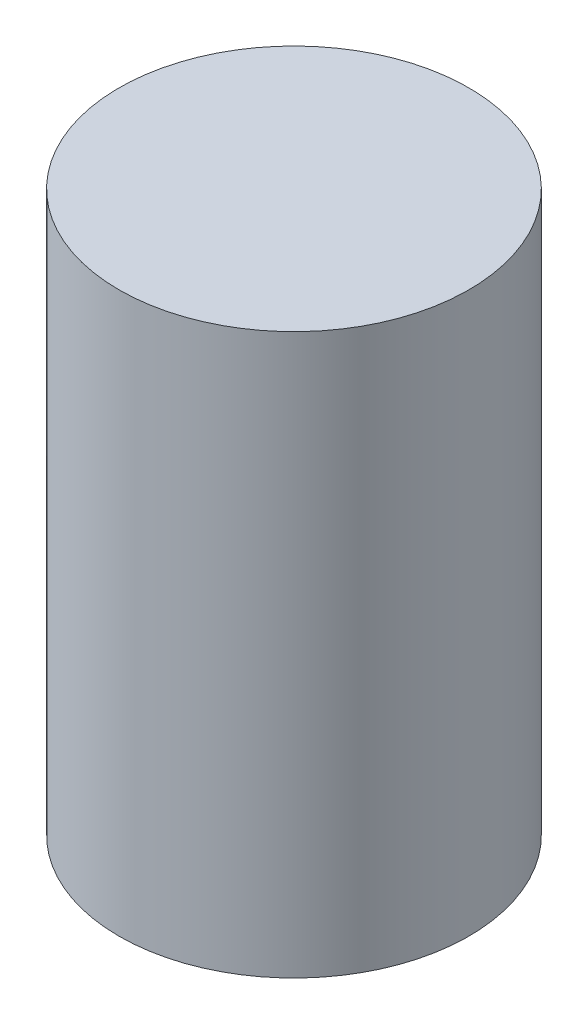
ISO-10303-21;
HEADER;
FILE_DESCRIPTION(('STEP AP214'),'2;1');
FILE_NAME('part.step','',(''),(''),'','','');
FILE_SCHEMA(('AUTOMOTIVE_DESIGN { 1 0 10303 214 1 1 1 1 }'));
ENDSEC;
DATA;
#1=APPLICATION_CONTEXT('core data for automotive mechanical design processes');
#2=APPLICATION_PROTOCOL_DEFINITION('international standard','automotive_design',2000,#1);
#3=PRODUCT_CONTEXT('',#1,'mechanical');
#4=PRODUCT('Part','Part','',(#3));
#5=PRODUCT_RELATED_PRODUCT_CATEGORY('part','',(#4));
#6=PRODUCT_DEFINITION_FORMATION('','',#4);
#7=PRODUCT_DEFINITION_CONTEXT('part definition',#1,'design');
#8=PRODUCT_DEFINITION('design','',#6,#7);
#9=PRODUCT_DEFINITION_SHAPE('','',#8);
#10=(LENGTH_UNIT() NAMED_UNIT(*) SI_UNIT(.MILLI.,.METRE.));
#11=(NAMED_UNIT(*) PLANE_ANGLE_UNIT() SI_UNIT($,.RADIAN.));
#12=(NAMED_UNIT(*) SI_UNIT($,.STERADIAN.) SOLID_ANGLE_UNIT());
#13=UNCERTAINTY_MEASURE_WITH_UNIT(LENGTH_MEASURE(1.E-05),#10,'distance_accuracy_value','');
#14=(GEOMETRIC_REPRESENTATION_CONTEXT(3) GLOBAL_UNCERTAINTY_ASSIGNED_CONTEXT((#13)) GLOBAL_UNIT_ASSIGNED_CONTEXT((#10,
#11,#12)) REPRESENTATION_CONTEXT('',''));
#15=CARTESIAN_POINT('',(0.,0.,0.));
#16=DIRECTION('',(0.,0.,1.));
#17=DIRECTION('',(1.,0.,0.));
#18=AXIS2_PLACEMENT_3D('',#15,#16,#17);
#19=CARTESIAN_POINT('',(0.,203.2,0.));
#20=DIRECTION('',(0.,-1.,0.));
#21=DIRECTION('',(0.,0.,-1.));
#22=AXIS2_PLACEMENT_3D('',#19,#20,#21);
#23=CYLINDRICAL_SURFACE('',#22,63.5);
#24=CARTESIAN_POINT('',(0.,203.2,0.));
#25=DIRECTION('',(0.,1.,0.));
#26=DIRECTION('',(0.,0.,1.));
#27=AXIS2_PLACEMENT_3D('',#24,#25,#26);
#28=CIRCLE('',#27,63.5);
#29=CARTESIAN_POINT('',(0.,203.2,63.5));
#30=VERTEX_POINT('',#29);
#31=EDGE_CURVE('E10',#30,#30,#28,.T.);
#32=ORIENTED_EDGE('',*,*,#31,.F.);
#33=EDGE_LOOP('',(#32));
#34=FACE_BOUND('',#33,.T.);
#35=CARTESIAN_POINT('',(0.,0.,0.));
#36=DIRECTION('',(0.,1.,0.));
#37=DIRECTION('',(0.,0.,1.));
#38=AXIS2_PLACEMENT_3D('',#35,#36,#37);
#39=CIRCLE('',#38,63.5);
#40=CARTESIAN_POINT('',(0.,0.,63.5));
#41=VERTEX_POINT('',#40);
#42=EDGE_CURVE('E35',#41,#41,#39,.T.);
#43=ORIENTED_EDGE('',*,*,#42,.T.);
#44=EDGE_LOOP('',(#43));
#45=FACE_BOUND('',#44,.T.);
#46=ADVANCED_FACE('F32',(#34,#45),#23,.T.);
#47=CARTESIAN_POINT('',(0.,203.2,0.));
#48=DIRECTION('',(0.,1.,0.));
#49=DIRECTION('',(0.,0.,1.));
#50=AXIS2_PLACEMENT_3D('',#47,#48,#49);
#51=PLANE('',#50);
#52=ORIENTED_EDGE('',*,*,#31,.T.);
#53=EDGE_LOOP('',(#52));
#54=FACE_BOUND('',#53,.T.);
#55=ADVANCED_FACE('F47',(#54),#51,.T.);
#56=CARTESIAN_POINT('',(0.,0.,0.));
#57=DIRECTION('',(0.,1.,0.));
#58=DIRECTION('',(0.,0.,1.));
#59=AXIS2_PLACEMENT_3D('',#56,#57,#58);
#60=PLANE('',#59);
#61=ORIENTED_EDGE('',*,*,#42,.F.);
#62=EDGE_LOOP('',(#61));
#63=FACE_BOUND('',#62,.T.);
#64=ADVANCED_FACE('F45',(#63),#60,.F.);
#65=CLOSED_SHELL('',(#46,#55,#64));
#66=MANIFOLD_SOLID_BREP('B2',#65);
#67=ADVANCED_BREP_SHAPE_REPRESENTATION('',(#18,#66),#14);
#68=SHAPE_DEFINITION_REPRESENTATION(#9,#67);
ENDSEC;
END-ISO-10303-21;
